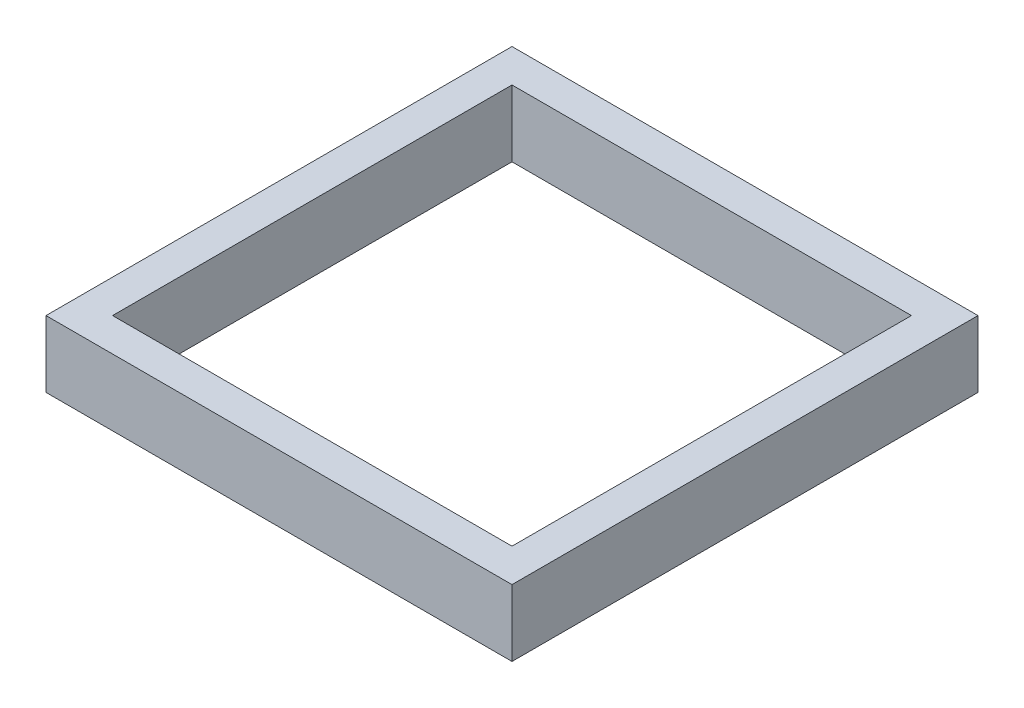
ISO-10303-21;
HEADER;
FILE_DESCRIPTION(('STEP AP214'),'2;1');
FILE_NAME('part.step','',(''),(''),'','','');
FILE_SCHEMA(('AUTOMOTIVE_DESIGN { 1 0 10303 214 1 1 1 1 }'));
ENDSEC;
DATA;
#1=APPLICATION_CONTEXT('core data for automotive mechanical design processes');
#2=APPLICATION_PROTOCOL_DEFINITION('international standard','automotive_design',2000,#1);
#3=PRODUCT_CONTEXT('',#1,'mechanical');
#4=PRODUCT('Part','Part','',(#3));
#5=PRODUCT_RELATED_PRODUCT_CATEGORY('part','',(#4));
#6=PRODUCT_DEFINITION_FORMATION('','',#4);
#7=PRODUCT_DEFINITION_CONTEXT('part definition',#1,'design');
#8=PRODUCT_DEFINITION('design','',#6,#7);
#9=PRODUCT_DEFINITION_SHAPE('','',#8);
#10=(LENGTH_UNIT() NAMED_UNIT(*) SI_UNIT(.MILLI.,.METRE.));
#11=(NAMED_UNIT(*) PLANE_ANGLE_UNIT() SI_UNIT($,.RADIAN.));
#12=(NAMED_UNIT(*) SI_UNIT($,.STERADIAN.) SOLID_ANGLE_UNIT());
#13=UNCERTAINTY_MEASURE_WITH_UNIT(LENGTH_MEASURE(1.E-05),#10,'distance_accuracy_value','');
#14=(GEOMETRIC_REPRESENTATION_CONTEXT(3) GLOBAL_UNCERTAINTY_ASSIGNED_CONTEXT((#13)) GLOBAL_UNIT_ASSIGNED_CONTEXT((#10,
#11,#12)) REPRESENTATION_CONTEXT('',''));
#15=CARTESIAN_POINT('',(0.,0.,0.));
#16=DIRECTION('',(0.,0.,1.));
#17=DIRECTION('',(1.,0.,0.));
#18=AXIS2_PLACEMENT_3D('',#15,#16,#17);
#19=CARTESIAN_POINT('',(0.,100.,0.));
#20=DIRECTION('',(0.,1.,0.));
#21=DIRECTION('',(0.,0.,1.));
#22=AXIS2_PLACEMENT_3D('',#19,#20,#21);
#23=PLANE('',#22);
#24=DIRECTION('',(0.,0.,1.));
#25=VECTOR('',#24,1.);
#26=CARTESIAN_POINT('',(-643.194394822465,100.,-156.639849666518));
#27=LINE('',#26,#25);
#28=CARTESIAN_POINT('',(-643.194394822465,100.,-156.639849666518));
#29=VERTEX_POINT('',#28);
#30=CARTESIAN_POINT('',(-643.194394822465,100.,543.360150333482));
#31=VERTEX_POINT('',#30);
#32=EDGE_CURVE('E153',#29,#31,#27,.T.);
#33=ORIENTED_EDGE('',*,*,#32,.T.);
#34=DIRECTION('',(1.,0.,0.));
#35=VECTOR('',#34,1.);
#36=CARTESIAN_POINT('',(-643.194394822465,100.,543.360150333482));
#37=LINE('',#36,#35);
#38=CARTESIAN_POINT('',(56.8056051775349,100.,543.360150333482));
#39=VERTEX_POINT('',#38);
#40=EDGE_CURVE('E157',#31,#39,#37,.T.);
#41=ORIENTED_EDGE('',*,*,#40,.T.);
#42=DIRECTION('',(0.,0.,-1.));
#43=VECTOR('',#42,1.);
#44=CARTESIAN_POINT('',(56.8056051775347,100.,-156.639849666518));
#45=LINE('',#44,#43);
#46=CARTESIAN_POINT('',(56.8056051775347,100.,-156.639849666518));
#47=VERTEX_POINT('',#46);
#48=EDGE_CURVE('E161',#39,#47,#45,.T.);
#49=ORIENTED_EDGE('',*,*,#48,.T.);
#50=DIRECTION('',(-1.,0.,0.));
#51=VECTOR('',#50,1.);
#52=CARTESIAN_POINT('',(-643.194394822465,100.,-156.639849666518));
#53=LINE('',#52,#51);
#54=EDGE_CURVE('E164',#47,#29,#53,.T.);
#55=ORIENTED_EDGE('',*,*,#54,.T.);
#56=EDGE_LOOP('',(#33,#41,#49,#55));
#57=FACE_BOUND('',#56,.T.);
#58=DIRECTION('',(1.,0.,0.));
#59=VECTOR('',#58,1.);
#60=CARTESIAN_POINT('',(-593.194394822465,100.,493.360150333482));
#61=LINE('',#60,#59);
#62=CARTESIAN_POINT('',(-593.194394822465,100.,493.360150333482));
#63=VERTEX_POINT('',#62);
#64=CARTESIAN_POINT('',(6.80560517753481,100.,493.360150333482));
#65=VERTEX_POINT('',#64);
#66=EDGE_CURVE('E114',#63,#65,#61,.T.);
#67=ORIENTED_EDGE('',*,*,#66,.F.);
#68=DIRECTION('',(0.,0.,1.));
#69=VECTOR('',#68,1.);
#70=CARTESIAN_POINT('',(-593.194394822465,100.,-106.639849666518));
#71=LINE('',#70,#69);
#72=CARTESIAN_POINT('',(-593.194394822465,100.,-106.639849666518));
#73=VERTEX_POINT('',#72);
#74=EDGE_CURVE('E105',#73,#63,#71,.T.);
#75=ORIENTED_EDGE('',*,*,#74,.F.);
#76=DIRECTION('',(-1.,0.,0.));
#77=VECTOR('',#76,1.);
#78=CARTESIAN_POINT('',(-593.194394822465,100.,-106.639849666518));
#79=LINE('',#78,#77);
#80=CARTESIAN_POINT('',(6.80560517753475,100.,-106.639849666518));
#81=VERTEX_POINT('',#80);
#82=EDGE_CURVE('E131',#81,#73,#79,.T.);
#83=ORIENTED_EDGE('',*,*,#82,.F.);
#84=DIRECTION('',(0.,0.,-1.));
#85=VECTOR('',#84,1.);
#86=CARTESIAN_POINT('',(6.80560517753475,100.,-106.639849666518));
#87=LINE('',#86,#85);
#88=EDGE_CURVE('E127',#65,#81,#87,.T.);
#89=ORIENTED_EDGE('',*,*,#88,.F.);
#90=EDGE_LOOP('',(#67,#75,#83,#89));
#91=FACE_BOUND('',#90,.T.);
#92=ADVANCED_FACE('F39',(#57,#91),#23,.T.);
#93=CARTESIAN_POINT('',(0.,0.,0.));
#94=DIRECTION('',(0.,1.,0.));
#95=DIRECTION('',(0.,0.,1.));
#96=AXIS2_PLACEMENT_3D('',#93,#94,#95);
#97=PLANE('',#96);
#98=DIRECTION('',(0.,0.,1.));
#99=VECTOR('',#98,1.);
#100=CARTESIAN_POINT('',(-643.194394822465,0.,-156.639849666518));
#101=LINE('',#100,#99);
#102=CARTESIAN_POINT('',(-643.194394822465,0.,-156.639849666518));
#103=VERTEX_POINT('',#102);
#104=CARTESIAN_POINT('',(-643.194394822465,0.,543.360150333482));
#105=VERTEX_POINT('',#104);
#106=EDGE_CURVE('E123',#103,#105,#101,.T.);
#107=ORIENTED_EDGE('',*,*,#106,.F.);
#108=DIRECTION('',(-1.,0.,0.));
#109=VECTOR('',#108,1.);
#110=CARTESIAN_POINT('',(-643.194394822465,0.,-156.639849666518));
#111=LINE('',#110,#109);
#112=CARTESIAN_POINT('',(56.8056051775347,0.,-156.639849666518));
#113=VERTEX_POINT('',#112);
#114=EDGE_CURVE('E158',#113,#103,#111,.T.);
#115=ORIENTED_EDGE('',*,*,#114,.F.);
#116=DIRECTION('',(0.,0.,-1.));
#117=VECTOR('',#116,1.);
#118=CARTESIAN_POINT('',(56.8056051775347,0.,-156.639849666518));
#119=LINE('',#118,#117);
#120=CARTESIAN_POINT('',(56.8056051775349,0.,543.360150333482));
#121=VERTEX_POINT('',#120);
#122=EDGE_CURVE('E174',#121,#113,#119,.T.);
#123=ORIENTED_EDGE('',*,*,#122,.F.);
#124=DIRECTION('',(1.,0.,0.));
#125=VECTOR('',#124,1.);
#126=CARTESIAN_POINT('',(-643.194394822465,0.,543.360150333482));
#127=LINE('',#126,#125);
#128=EDGE_CURVE('E171',#105,#121,#127,.T.);
#129=ORIENTED_EDGE('',*,*,#128,.F.);
#130=EDGE_LOOP('',(#107,#115,#123,#129));
#131=FACE_BOUND('',#130,.T.);
#132=DIRECTION('',(0.,0.,1.));
#133=VECTOR('',#132,1.);
#134=CARTESIAN_POINT('',(-593.194394822465,0.,-106.639849666518));
#135=LINE('',#134,#133);
#136=CARTESIAN_POINT('',(-593.194394822465,0.,-106.639849666518));
#137=VERTEX_POINT('',#136);
#138=CARTESIAN_POINT('',(-593.194394822465,0.,493.360150333482));
#139=VERTEX_POINT('',#138);
#140=EDGE_CURVE('E63',#137,#139,#135,.T.);
#141=ORIENTED_EDGE('',*,*,#140,.T.);
#142=DIRECTION('',(1.,0.,0.));
#143=VECTOR('',#142,1.);
#144=CARTESIAN_POINT('',(-593.194394822465,0.,493.360150333482));
#145=LINE('',#144,#143);
#146=CARTESIAN_POINT('',(6.80560517753481,0.,493.360150333482));
#147=VERTEX_POINT('',#146);
#148=EDGE_CURVE('E121',#139,#147,#145,.T.);
#149=ORIENTED_EDGE('',*,*,#148,.T.);
#150=DIRECTION('',(0.,0.,-1.));
#151=VECTOR('',#150,1.);
#152=CARTESIAN_POINT('',(6.80560517753475,0.,-106.639849666518));
#153=LINE('',#152,#151);
#154=CARTESIAN_POINT('',(6.80560517753475,0.,-106.639849666518));
#155=VERTEX_POINT('',#154);
#156=EDGE_CURVE('E140',#147,#155,#153,.T.);
#157=ORIENTED_EDGE('',*,*,#156,.T.);
#158=DIRECTION('',(-1.,0.,0.));
#159=VECTOR('',#158,1.);
#160=CARTESIAN_POINT('',(-593.194394822465,0.,-106.639849666518));
#161=LINE('',#160,#159);
#162=EDGE_CURVE('E115',#155,#137,#161,.T.);
#163=ORIENTED_EDGE('',*,*,#162,.T.);
#164=EDGE_LOOP('',(#141,#149,#157,#163));
#165=FACE_BOUND('',#164,.T.);
#166=ADVANCED_FACE('F197',(#131,#165),#97,.F.);
#167=CARTESIAN_POINT('',(-643.194394822465,100.,-156.639849666518));
#168=DIRECTION('',(1.,0.,0.));
#169=DIRECTION('',(0.,0.,-1.));
#170=AXIS2_PLACEMENT_3D('',#167,#168,#169);
#171=PLANE('',#170);
#172=ORIENTED_EDGE('',*,*,#106,.T.);
#173=DIRECTION('',(0.,-1.,0.));
#174=VECTOR('',#173,1.);
#175=CARTESIAN_POINT('',(-643.194394822465,100.,543.360150333482));
#176=LINE('',#175,#174);
#177=EDGE_CURVE('E11',#31,#105,#176,.T.);
#178=ORIENTED_EDGE('',*,*,#177,.F.);
#179=ORIENTED_EDGE('',*,*,#32,.F.);
#180=DIRECTION('',(0.,-1.,0.));
#181=VECTOR('',#180,1.);
#182=CARTESIAN_POINT('',(-643.194394822465,100.,-156.639849666518));
#183=LINE('',#182,#181);
#184=EDGE_CURVE('E167',#29,#103,#183,.T.);
#185=ORIENTED_EDGE('',*,*,#184,.T.);
#186=EDGE_LOOP('',(#172,#178,#179,#185));
#187=FACE_BOUND('',#186,.T.);
#188=ADVANCED_FACE('F41',(#187),#171,.F.);
#189=CARTESIAN_POINT('',(-643.194394822465,100.,543.360150333482));
#190=DIRECTION('',(0.,0.,-1.));
#191=DIRECTION('',(-1.,0.,0.));
#192=AXIS2_PLACEMENT_3D('',#189,#190,#191);
#193=PLANE('',#192);
#194=ORIENTED_EDGE('',*,*,#128,.T.);
#195=DIRECTION('',(0.,-1.,0.));
#196=VECTOR('',#195,1.);
#197=CARTESIAN_POINT('',(56.8056051775349,100.,543.360150333482));
#198=LINE('',#197,#196);
#199=EDGE_CURVE('E48',#39,#121,#198,.T.);
#200=ORIENTED_EDGE('',*,*,#199,.F.);
#201=ORIENTED_EDGE('',*,*,#40,.F.);
#202=ORIENTED_EDGE('',*,*,#177,.T.);
#203=EDGE_LOOP('',(#194,#200,#201,#202));
#204=FACE_BOUND('',#203,.T.);
#205=ADVANCED_FACE('F207',(#204),#193,.F.);
#206=CARTESIAN_POINT('',(56.8056051775347,100.,-156.639849666518));
#207=DIRECTION('',(-1.,0.,0.));
#208=DIRECTION('',(0.,0.,1.));
#209=AXIS2_PLACEMENT_3D('',#206,#207,#208);
#210=PLANE('',#209);
#211=ORIENTED_EDGE('',*,*,#122,.T.);
#212=DIRECTION('',(0.,-1.,0.));
#213=VECTOR('',#212,1.);
#214=CARTESIAN_POINT('',(56.8056051775347,100.,-156.639849666518));
#215=LINE('',#214,#213);
#216=EDGE_CURVE('E182',#47,#113,#215,.T.);
#217=ORIENTED_EDGE('',*,*,#216,.F.);
#218=ORIENTED_EDGE('',*,*,#48,.F.);
#219=ORIENTED_EDGE('',*,*,#199,.T.);
#220=EDGE_LOOP('',(#211,#217,#218,#219));
#221=FACE_BOUND('',#220,.T.);
#222=ADVANCED_FACE('F191',(#221),#210,.F.);
#223=CARTESIAN_POINT('',(-643.194394822465,100.,-156.639849666518));
#224=DIRECTION('',(0.,0.,1.));
#225=DIRECTION('',(1.,0.,0.));
#226=AXIS2_PLACEMENT_3D('',#223,#224,#225);
#227=PLANE('',#226);
#228=ORIENTED_EDGE('',*,*,#114,.T.);
#229=ORIENTED_EDGE('',*,*,#184,.F.);
#230=ORIENTED_EDGE('',*,*,#54,.F.);
#231=ORIENTED_EDGE('',*,*,#216,.T.);
#232=EDGE_LOOP('',(#228,#229,#230,#231));
#233=FACE_BOUND('',#232,.T.);
#234=ADVANCED_FACE('F201',(#233),#227,.F.);
#235=CARTESIAN_POINT('',(-593.194394822465,100.,-106.639849666518));
#236=DIRECTION('',(1.,0.,0.));
#237=DIRECTION('',(0.,0.,-1.));
#238=AXIS2_PLACEMENT_3D('',#235,#236,#237);
#239=PLANE('',#238);
#240=ORIENTED_EDGE('',*,*,#140,.F.);
#241=DIRECTION('',(0.,-1.,0.));
#242=VECTOR('',#241,1.);
#243=CARTESIAN_POINT('',(-593.194394822465,100.,-106.639849666518));
#244=LINE('',#243,#242);
#245=EDGE_CURVE('E109',#73,#137,#244,.T.);
#246=ORIENTED_EDGE('',*,*,#245,.F.);
#247=ORIENTED_EDGE('',*,*,#74,.T.);
#248=DIRECTION('',(0.,-1.,0.));
#249=VECTOR('',#248,1.);
#250=CARTESIAN_POINT('',(-593.194394822465,100.,493.360150333482));
#251=LINE('',#250,#249);
#252=EDGE_CURVE('E108',#63,#139,#251,.T.);
#253=ORIENTED_EDGE('',*,*,#252,.T.);
#254=EDGE_LOOP('',(#240,#246,#247,#253));
#255=FACE_BOUND('',#254,.T.);
#256=ADVANCED_FACE('F107',(#255),#239,.T.);
#257=CARTESIAN_POINT('',(-593.194394822465,100.,493.360150333482));
#258=DIRECTION('',(0.,0.,-1.));
#259=DIRECTION('',(-1.,0.,0.));
#260=AXIS2_PLACEMENT_3D('',#257,#258,#259);
#261=PLANE('',#260);
#262=ORIENTED_EDGE('',*,*,#148,.F.);
#263=ORIENTED_EDGE('',*,*,#252,.F.);
#264=ORIENTED_EDGE('',*,*,#66,.T.);
#265=DIRECTION('',(0.,-1.,0.));
#266=VECTOR('',#265,1.);
#267=CARTESIAN_POINT('',(6.80560517753481,100.,493.360150333482));
#268=LINE('',#267,#266);
#269=EDGE_CURVE('E124',#65,#147,#268,.T.);
#270=ORIENTED_EDGE('',*,*,#269,.T.);
#271=EDGE_LOOP('',(#262,#263,#264,#270));
#272=FACE_BOUND('',#271,.T.);
#273=ADVANCED_FACE('F118',(#272),#261,.T.);
#274=CARTESIAN_POINT('',(6.80560517753475,100.,-106.639849666518));
#275=DIRECTION('',(-1.,0.,0.));
#276=DIRECTION('',(0.,0.,1.));
#277=AXIS2_PLACEMENT_3D('',#274,#275,#276);
#278=PLANE('',#277);
#279=ORIENTED_EDGE('',*,*,#156,.F.);
#280=ORIENTED_EDGE('',*,*,#269,.F.);
#281=ORIENTED_EDGE('',*,*,#88,.T.);
#282=DIRECTION('',(0.,-1.,0.));
#283=VECTOR('',#282,1.);
#284=CARTESIAN_POINT('',(6.80560517753475,100.,-106.639849666518));
#285=LINE('',#284,#283);
#286=EDGE_CURVE('E55',#81,#155,#285,.T.);
#287=ORIENTED_EDGE('',*,*,#286,.T.);
#288=EDGE_LOOP('',(#279,#280,#281,#287));
#289=FACE_BOUND('',#288,.T.);
#290=ADVANCED_FACE('F230',(#289),#278,.T.);
#291=CARTESIAN_POINT('',(-593.194394822465,100.,-106.639849666518));
#292=DIRECTION('',(0.,0.,1.));
#293=DIRECTION('',(1.,0.,0.));
#294=AXIS2_PLACEMENT_3D('',#291,#292,#293);
#295=PLANE('',#294);
#296=ORIENTED_EDGE('',*,*,#162,.F.);
#297=ORIENTED_EDGE('',*,*,#286,.F.);
#298=ORIENTED_EDGE('',*,*,#82,.T.);
#299=ORIENTED_EDGE('',*,*,#245,.T.);
#300=EDGE_LOOP('',(#296,#297,#298,#299));
#301=FACE_BOUND('',#300,.T.);
#302=ADVANCED_FACE('F234',(#301),#295,.T.);
#303=CLOSED_SHELL('',(#92,#166,#188,#205,#222,#234,#256,#273,#290,#302));
#304=MANIFOLD_SOLID_BREP('B2',#303);
#305=ADVANCED_BREP_SHAPE_REPRESENTATION('',(#18,#304),#14);
#306=SHAPE_DEFINITION_REPRESENTATION(#9,#305);
ENDSEC;
END-ISO-10303-21;
